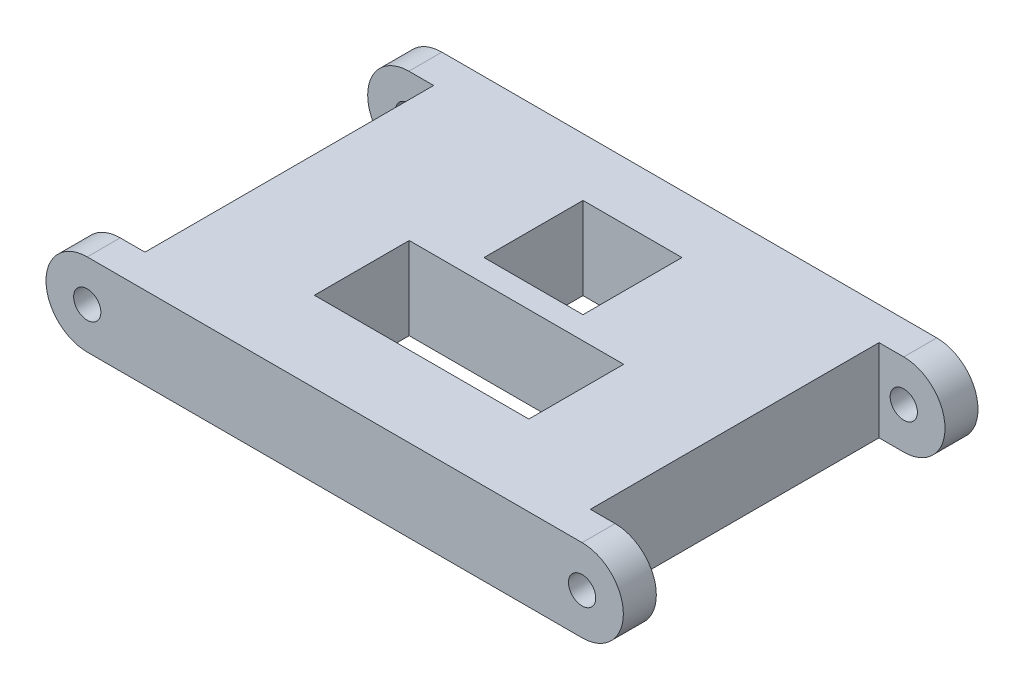
ISO-10303-21;
HEADER;
FILE_DESCRIPTION(('STEP AP214'),'2;1');
FILE_NAME('part.step','',(''),(''),'','','');
FILE_SCHEMA(('AUTOMOTIVE_DESIGN { 1 0 10303 214 1 1 1 1 }'));
ENDSEC;
DATA;
#1=APPLICATION_CONTEXT('core data for automotive mechanical design processes');
#2=APPLICATION_PROTOCOL_DEFINITION('international standard','automotive_design',2000,#1);
#3=PRODUCT_CONTEXT('',#1,'mechanical');
#4=PRODUCT('Part','Part','',(#3));
#5=PRODUCT_RELATED_PRODUCT_CATEGORY('part','',(#4));
#6=PRODUCT_DEFINITION_FORMATION('','',#4);
#7=PRODUCT_DEFINITION_CONTEXT('part definition',#1,'design');
#8=PRODUCT_DEFINITION('design','',#6,#7);
#9=PRODUCT_DEFINITION_SHAPE('','',#8);
#10=(LENGTH_UNIT() NAMED_UNIT(*) SI_UNIT(.MILLI.,.METRE.));
#11=(NAMED_UNIT(*) PLANE_ANGLE_UNIT() SI_UNIT($,.RADIAN.));
#12=(NAMED_UNIT(*) SI_UNIT($,.STERADIAN.) SOLID_ANGLE_UNIT());
#13=UNCERTAINTY_MEASURE_WITH_UNIT(LENGTH_MEASURE(1.E-05),#10,'distance_accuracy_value','');
#14=(GEOMETRIC_REPRESENTATION_CONTEXT(3) GLOBAL_UNCERTAINTY_ASSIGNED_CONTEXT((#13)) GLOBAL_UNIT_ASSIGNED_CONTEXT((#10,
#11,#12)) REPRESENTATION_CONTEXT('',''));
#15=CARTESIAN_POINT('',(0.,0.,0.));
#16=DIRECTION('',(0.,0.,1.));
#17=DIRECTION('',(1.,0.,0.));
#18=AXIS2_PLACEMENT_3D('',#15,#16,#17);
#19=CARTESIAN_POINT('',(0.,0.,4.));
#20=DIRECTION('',(0.,0.,1.));
#21=DIRECTION('',(1.,0.,0.));
#22=AXIS2_PLACEMENT_3D('',#19,#20,#21);
#23=PLANE('',#22);
#24=CARTESIAN_POINT('',(60.,0.,4.));
#25=DIRECTION('',(0.,0.,1.));
#26=DIRECTION('',(1.,0.,0.));
#27=AXIS2_PLACEMENT_3D('',#24,#25,#26);
#28=CIRCLE('',#27,1.65);
#29=CARTESIAN_POINT('',(61.65,0.,4.));
#30=VERTEX_POINT('',#29);
#31=EDGE_CURVE('E331',#30,#30,#28,.T.);
#32=ORIENTED_EDGE('',*,*,#31,.F.);
#33=EDGE_LOOP('',(#32));
#34=FACE_BOUND('',#33,.T.);
#35=DIRECTION('',(1.,0.,0.));
#36=VECTOR('',#35,1.);
#37=CARTESIAN_POINT('',(0.,5.,4.));
#38=LINE('',#37,#36);
#39=CARTESIAN_POINT('',(57.,5.,4.));
#40=VERTEX_POINT('',#39);
#41=CARTESIAN_POINT('',(60.,5.,4.));
#42=VERTEX_POINT('',#41);
#43=EDGE_CURVE('E321',#40,#42,#38,.T.);
#44=ORIENTED_EDGE('',*,*,#43,.F.);
#45=DIRECTION('',(0.,-1.,0.));
#46=VECTOR('',#45,1.);
#47=CARTESIAN_POINT('',(57.,5.,4.));
#48=LINE('',#47,#46);
#49=CARTESIAN_POINT('',(57.,-5.,4.));
#50=VERTEX_POINT('',#49);
#51=EDGE_CURVE('E299',#40,#50,#48,.T.);
#52=ORIENTED_EDGE('',*,*,#51,.T.);
#53=DIRECTION('',(-1.,0.,0.));
#54=VECTOR('',#53,1.);
#55=CARTESIAN_POINT('',(0.,-5.,4.));
#56=LINE('',#55,#54);
#57=CARTESIAN_POINT('',(60.,-5.,4.));
#58=VERTEX_POINT('',#57);
#59=EDGE_CURVE('E314',#58,#50,#56,.T.);
#60=ORIENTED_EDGE('',*,*,#59,.F.);
#61=CARTESIAN_POINT('',(60.,0.,4.));
#62=DIRECTION('',(0.,0.,1.));
#63=DIRECTION('',(1.,0.,0.));
#64=AXIS2_PLACEMENT_3D('',#61,#62,#63);
#65=CIRCLE('',#64,5.);
#66=EDGE_CURVE('E317',#58,#42,#65,.T.);
#67=ORIENTED_EDGE('',*,*,#66,.T.);
#68=EDGE_LOOP('',(#44,#52,#60,#67));
#69=FACE_BOUND('',#68,.T.);
#70=ADVANCED_FACE('F36',(#34,#69),#23,.T.);
#71=CARTESIAN_POINT('',(0.,-5.,4.));
#72=DIRECTION('',(0.,-1.,0.));
#73=DIRECTION('',(0.,0.,-1.));
#74=AXIS2_PLACEMENT_3D('',#71,#72,#73);
#75=PLANE('',#74);
#76=DIRECTION('',(1.,0.,0.));
#77=VECTOR('',#76,1.);
#78=CARTESIAN_POINT('',(0.,-5.,21.7568160421216));
#79=LINE('',#78,#77);
#80=CARTESIAN_POINT('',(17.7948409969749,-5.,21.7568160421216));
#81=VERTEX_POINT('',#80);
#82=CARTESIAN_POINT('',(43.7948409969749,-5.,21.7568160421216));
#83=VERTEX_POINT('',#82);
#84=EDGE_CURVE('E187',#81,#83,#79,.T.);
#85=ORIENTED_EDGE('',*,*,#84,.F.);
#86=DIRECTION('',(0.,0.,-1.));
#87=VECTOR('',#86,1.);
#88=CARTESIAN_POINT('',(17.7948409969749,-5.,3.99999999999999));
#89=LINE('',#88,#87);
#90=CARTESIAN_POINT('',(17.7948409969749,-5.,33.2568160421216));
#91=VERTEX_POINT('',#90);
#92=EDGE_CURVE('E240',#91,#81,#89,.T.);
#93=ORIENTED_EDGE('',*,*,#92,.F.);
#94=DIRECTION('',(1.,0.,0.));
#95=VECTOR('',#94,1.);
#96=CARTESIAN_POINT('',(0.,-5.,33.2568160421216));
#97=LINE('',#96,#95);
#98=CARTESIAN_POINT('',(43.7948409969749,-5.,33.2568160421216));
#99=VERTEX_POINT('',#98);
#100=EDGE_CURVE('E237',#91,#99,#97,.T.);
#101=ORIENTED_EDGE('',*,*,#100,.T.);
#102=DIRECTION('',(0.,0.,-1.));
#103=VECTOR('',#102,1.);
#104=CARTESIAN_POINT('',(43.7948409969749,-5.,4.));
#105=LINE('',#104,#103);
#106=EDGE_CURVE('E235',#99,#83,#105,.T.);
#107=ORIENTED_EDGE('',*,*,#106,.T.);
#108=EDGE_LOOP('',(#85,#93,#101,#107));
#109=FACE_BOUND('',#108,.T.);
#110=DIRECTION('',(1.,0.,0.));
#111=VECTOR('',#110,1.);
#112=CARTESIAN_POINT('',(0.,-5.,7.01289265091276));
#113=LINE('',#112,#111);
#114=CARTESIAN_POINT('',(24.1223046181314,-5.,7.01289265091276));
#115=VERTEX_POINT('',#114);
#116=CARTESIAN_POINT('',(36.1223046181314,-5.,7.01289265091276));
#117=VERTEX_POINT('',#116);
#118=EDGE_CURVE('E233',#115,#117,#113,.T.);
#119=ORIENTED_EDGE('',*,*,#118,.F.);
#120=DIRECTION('',(0.,0.,-1.));
#121=VECTOR('',#120,1.);
#122=CARTESIAN_POINT('',(24.1223046181314,-5.,4.));
#123=LINE('',#122,#121);
#124=CARTESIAN_POINT('',(24.1223046181314,-5.,19.0128926509128));
#125=VERTEX_POINT('',#124);
#126=EDGE_CURVE('E231',#125,#115,#123,.T.);
#127=ORIENTED_EDGE('',*,*,#126,.F.);
#128=DIRECTION('',(1.,0.,0.));
#129=VECTOR('',#128,1.);
#130=CARTESIAN_POINT('',(0.,-5.,19.0128926509128));
#131=LINE('',#130,#129);
#132=CARTESIAN_POINT('',(36.1223046181314,-5.,19.0128926509128));
#133=VERTEX_POINT('',#132);
#134=EDGE_CURVE('E228',#125,#133,#131,.T.);
#135=ORIENTED_EDGE('',*,*,#134,.T.);
#136=DIRECTION('',(0.,0.,-1.));
#137=VECTOR('',#136,1.);
#138=CARTESIAN_POINT('',(36.1223046181314,-5.,4.));
#139=LINE('',#138,#137);
#140=EDGE_CURVE('E204',#133,#117,#139,.T.);
#141=ORIENTED_EDGE('',*,*,#140,.T.);
#142=EDGE_LOOP('',(#119,#127,#135,#141));
#143=FACE_BOUND('',#142,.T.);
#144=DIRECTION('',(-1.,0.,0.));
#145=VECTOR('',#144,1.);
#146=CARTESIAN_POINT('',(0.,-5.,0.));
#147=LINE('',#146,#145);
#148=CARTESIAN_POINT('',(60.,-5.,0.));
#149=VERTEX_POINT('',#148);
#150=CARTESIAN_POINT('',(0.,-5.,0.));
#151=VERTEX_POINT('',#150);
#152=EDGE_CURVE('E313',#149,#151,#147,.T.);
#153=ORIENTED_EDGE('',*,*,#152,.F.);
#154=DIRECTION('',(0.,0.,-1.));
#155=VECTOR('',#154,1.);
#156=CARTESIAN_POINT('',(60.,-5.,4.));
#157=LINE('',#156,#155);
#158=EDGE_CURVE('E11',#58,#149,#157,.T.);
#159=ORIENTED_EDGE('',*,*,#158,.F.);
#160=ORIENTED_EDGE('',*,*,#59,.T.);
#161=DIRECTION('',(0.,0.,-1.));
#162=VECTOR('',#161,1.);
#163=CARTESIAN_POINT('',(57.,-5.,21.5));
#164=LINE('',#163,#162);
#165=CARTESIAN_POINT('',(57.,-5.,39.));
#166=VERTEX_POINT('',#165);
#167=EDGE_CURVE('E304',#166,#50,#164,.T.);
#168=ORIENTED_EDGE('',*,*,#167,.F.);
#169=DIRECTION('',(-1.,0.,0.));
#170=VECTOR('',#169,1.);
#171=CARTESIAN_POINT('',(0.,-5.,39.));
#172=LINE('',#171,#170);
#173=CARTESIAN_POINT('',(60.,-5.,39.));
#174=VERTEX_POINT('',#173);
#175=EDGE_CURVE('E250',#174,#166,#172,.T.);
#176=ORIENTED_EDGE('',*,*,#175,.F.);
#177=DIRECTION('',(0.,0.,1.));
#178=VECTOR('',#177,1.);
#179=CARTESIAN_POINT('',(60.,-5.,39.));
#180=LINE('',#179,#178);
#181=CARTESIAN_POINT('',(60.,-5.,43.));
#182=VERTEX_POINT('',#181);
#183=EDGE_CURVE('E293',#174,#182,#180,.T.);
#184=ORIENTED_EDGE('',*,*,#183,.T.);
#185=DIRECTION('',(-1.,0.,0.));
#186=VECTOR('',#185,1.);
#187=CARTESIAN_POINT('',(0.,-5.,43.));
#188=LINE('',#187,#186);
#189=CARTESIAN_POINT('',(0.,-5.,43.));
#190=VERTEX_POINT('',#189);
#191=EDGE_CURVE('E249',#182,#190,#188,.T.);
#192=ORIENTED_EDGE('',*,*,#191,.T.);
#193=DIRECTION('',(0.,0.,1.));
#194=VECTOR('',#193,1.);
#195=CARTESIAN_POINT('',(0.,-5.,39.));
#196=LINE('',#195,#194);
#197=CARTESIAN_POINT('',(0.,-5.,39.));
#198=VERTEX_POINT('',#197);
#199=EDGE_CURVE('E269',#198,#190,#196,.T.);
#200=ORIENTED_EDGE('',*,*,#199,.F.);
#201=CARTESIAN_POINT('',(2.99999999999999,-5.,39.));
#202=VERTEX_POINT('',#201);
#203=EDGE_CURVE('E254',#202,#198,#172,.T.);
#204=ORIENTED_EDGE('',*,*,#203,.F.);
#205=DIRECTION('',(0.,0.,-1.));
#206=VECTOR('',#205,1.);
#207=CARTESIAN_POINT('',(2.99999999999999,-5.,21.5));
#208=LINE('',#207,#206);
#209=CARTESIAN_POINT('',(2.99999999999999,-5.,4.));
#210=VERTEX_POINT('',#209);
#211=EDGE_CURVE('E307',#202,#210,#208,.T.);
#212=ORIENTED_EDGE('',*,*,#211,.T.);
#213=CARTESIAN_POINT('',(0.,-5.,4.));
#214=VERTEX_POINT('',#213);
#215=EDGE_CURVE('E318',#210,#214,#56,.T.);
#216=ORIENTED_EDGE('',*,*,#215,.T.);
#217=DIRECTION('',(0.,0.,-1.));
#218=VECTOR('',#217,1.);
#219=CARTESIAN_POINT('',(0.,-5.,4.));
#220=LINE('',#219,#218);
#221=EDGE_CURVE('E334',#214,#151,#220,.T.);
#222=ORIENTED_EDGE('',*,*,#221,.T.);
#223=EDGE_LOOP('',(#153,#159,#160,#168,#176,#184,#192,#200,#204,#212,#216,#222));
#224=FACE_BOUND('',#223,.T.);
#225=ADVANCED_FACE('F38',(#109,#143,#224),#75,.T.);
#226=CARTESIAN_POINT('',(60.,0.,4.));
#227=DIRECTION('',(0.,0.,-1.));
#228=DIRECTION('',(-1.,0.,0.));
#229=AXIS2_PLACEMENT_3D('',#226,#227,#228);
#230=CYLINDRICAL_SURFACE('',#229,5.);
#231=CARTESIAN_POINT('',(60.,0.,0.));
#232=DIRECTION('',(0.,0.,1.));
#233=DIRECTION('',(1.,0.,0.));
#234=AXIS2_PLACEMENT_3D('',#231,#232,#233);
#235=CIRCLE('',#234,5.);
#236=CARTESIAN_POINT('',(60.,5.,0.));
#237=VERTEX_POINT('',#236);
#238=EDGE_CURVE('E337',#149,#237,#235,.T.);
#239=ORIENTED_EDGE('',*,*,#238,.T.);
#240=DIRECTION('',(0.,0.,-1.));
#241=VECTOR('',#240,1.);
#242=CARTESIAN_POINT('',(60.,5.,4.));
#243=LINE('',#242,#241);
#244=EDGE_CURVE('E44',#42,#237,#243,.T.);
#245=ORIENTED_EDGE('',*,*,#244,.F.);
#246=ORIENTED_EDGE('',*,*,#66,.F.);
#247=ORIENTED_EDGE('',*,*,#158,.T.);
#248=EDGE_LOOP('',(#239,#245,#246,#247));
#249=FACE_BOUND('',#248,.T.);
#250=ADVANCED_FACE('F360',(#249),#230,.T.);
#251=CARTESIAN_POINT('',(0.,5.,4.));
#252=DIRECTION('',(0.,1.,0.));
#253=DIRECTION('',(0.,0.,1.));
#254=AXIS2_PLACEMENT_3D('',#251,#252,#253);
#255=PLANE('',#254);
#256=DIRECTION('',(1.,0.,0.));
#257=VECTOR('',#256,1.);
#258=CARTESIAN_POINT('',(17.7948409969749,5.,21.7568160421216));
#259=LINE('',#258,#257);
#260=CARTESIAN_POINT('',(17.7948409969749,5.,21.7568160421216));
#261=VERTEX_POINT('',#260);
#262=CARTESIAN_POINT('',(43.7948409969749,5.,21.7568160421216));
#263=VERTEX_POINT('',#262);
#264=EDGE_CURVE('E179',#261,#263,#259,.T.);
#265=ORIENTED_EDGE('',*,*,#264,.T.);
#266=DIRECTION('',(0.,0.,-1.));
#267=VECTOR('',#266,1.);
#268=CARTESIAN_POINT('',(43.7948409969749,5.,33.2568160421216));
#269=LINE('',#268,#267);
#270=CARTESIAN_POINT('',(43.7948409969749,5.,33.2568160421216));
#271=VERTEX_POINT('',#270);
#272=EDGE_CURVE('E170',#271,#263,#269,.T.);
#273=ORIENTED_EDGE('',*,*,#272,.F.);
#274=DIRECTION('',(1.,0.,0.));
#275=VECTOR('',#274,1.);
#276=CARTESIAN_POINT('',(17.7948409969749,5.,33.2568160421216));
#277=LINE('',#276,#275);
#278=CARTESIAN_POINT('',(17.7948409969749,5.,33.2568160421216));
#279=VERTEX_POINT('',#278);
#280=EDGE_CURVE('E178',#279,#271,#277,.T.);
#281=ORIENTED_EDGE('',*,*,#280,.F.);
#282=DIRECTION('',(0.,0.,-1.));
#283=VECTOR('',#282,1.);
#284=CARTESIAN_POINT('',(17.7948409969749,5.,33.2568160421216));
#285=LINE('',#284,#283);
#286=EDGE_CURVE('E189',#279,#261,#285,.T.);
#287=ORIENTED_EDGE('',*,*,#286,.T.);
#288=EDGE_LOOP('',(#265,#273,#281,#287));
#289=FACE_BOUND('',#288,.T.);
#290=DIRECTION('',(1.,0.,0.));
#291=VECTOR('',#290,1.);
#292=CARTESIAN_POINT('',(24.1223046181314,5.,7.01289265091276));
#293=LINE('',#292,#291);
#294=CARTESIAN_POINT('',(24.1223046181314,5.,7.01289265091276));
#295=VERTEX_POINT('',#294);
#296=CARTESIAN_POINT('',(36.1223046181314,5.,7.01289265091276));
#297=VERTEX_POINT('',#296);
#298=EDGE_CURVE('E194',#295,#297,#293,.T.);
#299=ORIENTED_EDGE('',*,*,#298,.T.);
#300=DIRECTION('',(0.,0.,-1.));
#301=VECTOR('',#300,1.);
#302=CARTESIAN_POINT('',(36.1223046181314,5.,19.0128926509128));
#303=LINE('',#302,#301);
#304=CARTESIAN_POINT('',(36.1223046181314,5.,19.0128926509128));
#305=VERTEX_POINT('',#304);
#306=EDGE_CURVE('E197',#305,#297,#303,.T.);
#307=ORIENTED_EDGE('',*,*,#306,.F.);
#308=DIRECTION('',(1.,0.,0.));
#309=VECTOR('',#308,1.);
#310=CARTESIAN_POINT('',(24.1223046181314,5.,19.0128926509128));
#311=LINE('',#310,#309);
#312=CARTESIAN_POINT('',(24.1223046181314,5.,19.0128926509128));
#313=VERTEX_POINT('',#312);
#314=EDGE_CURVE('E222',#313,#305,#311,.T.);
#315=ORIENTED_EDGE('',*,*,#314,.F.);
#316=DIRECTION('',(0.,0.,-1.));
#317=VECTOR('',#316,1.);
#318=CARTESIAN_POINT('',(24.1223046181314,5.,19.0128926509128));
#319=LINE('',#318,#317);
#320=EDGE_CURVE('E210',#313,#295,#319,.T.);
#321=ORIENTED_EDGE('',*,*,#320,.T.);
#322=EDGE_LOOP('',(#299,#307,#315,#321));
#323=FACE_BOUND('',#322,.T.);
#324=DIRECTION('',(1.,0.,0.));
#325=VECTOR('',#324,1.);
#326=CARTESIAN_POINT('',(0.,5.,0.));
#327=LINE('',#326,#325);
#328=CARTESIAN_POINT('',(0.,5.,0.));
#329=VERTEX_POINT('',#328);
#330=EDGE_CURVE('E340',#329,#237,#327,.T.);
#331=ORIENTED_EDGE('',*,*,#330,.F.);
#332=DIRECTION('',(0.,0.,-1.));
#333=VECTOR('',#332,1.);
#334=CARTESIAN_POINT('',(0.,5.,4.));
#335=LINE('',#334,#333);
#336=CARTESIAN_POINT('',(0.,5.,4.));
#337=VERTEX_POINT('',#336);
#338=EDGE_CURVE('E353',#337,#329,#335,.T.);
#339=ORIENTED_EDGE('',*,*,#338,.F.);
#340=CARTESIAN_POINT('',(2.99999999999999,5.,4.));
#341=VERTEX_POINT('',#340);
#342=EDGE_CURVE('E322',#337,#341,#38,.T.);
#343=ORIENTED_EDGE('',*,*,#342,.T.);
#344=DIRECTION('',(0.,0.,-1.));
#345=VECTOR('',#344,1.);
#346=CARTESIAN_POINT('',(3.,5.,21.5));
#347=LINE('',#346,#345);
#348=CARTESIAN_POINT('',(2.99999999999999,5.,39.));
#349=VERTEX_POINT('',#348);
#350=EDGE_CURVE('E310',#349,#341,#347,.T.);
#351=ORIENTED_EDGE('',*,*,#350,.F.);
#352=DIRECTION('',(1.,0.,0.));
#353=VECTOR('',#352,1.);
#354=CARTESIAN_POINT('',(0.,5.,39.));
#355=LINE('',#354,#353);
#356=CARTESIAN_POINT('',(0.,5.,39.));
#357=VERTEX_POINT('',#356);
#358=EDGE_CURVE('E258',#357,#349,#355,.T.);
#359=ORIENTED_EDGE('',*,*,#358,.F.);
#360=DIRECTION('',(0.,0.,1.));
#361=VECTOR('',#360,1.);
#362=CARTESIAN_POINT('',(0.,5.,39.));
#363=LINE('',#362,#361);
#364=CARTESIAN_POINT('',(0.,5.,43.));
#365=VERTEX_POINT('',#364);
#366=EDGE_CURVE('E287',#357,#365,#363,.T.);
#367=ORIENTED_EDGE('',*,*,#366,.T.);
#368=DIRECTION('',(1.,0.,0.));
#369=VECTOR('',#368,1.);
#370=CARTESIAN_POINT('',(0.,5.,43.));
#371=LINE('',#370,#369);
#372=CARTESIAN_POINT('',(60.,5.,43.));
#373=VERTEX_POINT('',#372);
#374=EDGE_CURVE('E275',#365,#373,#371,.T.);
#375=ORIENTED_EDGE('',*,*,#374,.T.);
#376=DIRECTION('',(0.,0.,1.));
#377=VECTOR('',#376,1.);
#378=CARTESIAN_POINT('',(60.,5.,39.));
#379=LINE('',#378,#377);
#380=CARTESIAN_POINT('',(60.,5.,39.));
#381=VERTEX_POINT('',#380);
#382=EDGE_CURVE('E290',#381,#373,#379,.T.);
#383=ORIENTED_EDGE('',*,*,#382,.F.);
#384=CARTESIAN_POINT('',(57.,5.,39.));
#385=VERTEX_POINT('',#384);
#386=EDGE_CURVE('E257',#385,#381,#355,.T.);
#387=ORIENTED_EDGE('',*,*,#386,.F.);
#388=DIRECTION('',(0.,0.,-1.));
#389=VECTOR('',#388,1.);
#390=CARTESIAN_POINT('',(57.,5.,21.5));
#391=LINE('',#390,#389);
#392=EDGE_CURVE('E301',#385,#40,#391,.T.);
#393=ORIENTED_EDGE('',*,*,#392,.T.);
#394=ORIENTED_EDGE('',*,*,#43,.T.);
#395=ORIENTED_EDGE('',*,*,#244,.T.);
#396=EDGE_LOOP('',(#331,#339,#343,#351,#359,#367,#375,#383,#387,#393,#394,#395));
#397=FACE_BOUND('',#396,.T.);
#398=ADVANCED_FACE('F191',(#289,#323,#397),#255,.T.);
#399=CARTESIAN_POINT('',(0.,0.,4.));
#400=DIRECTION('',(0.,0.,-1.));
#401=DIRECTION('',(-1.,0.,0.));
#402=AXIS2_PLACEMENT_3D('',#399,#400,#401);
#403=CYLINDRICAL_SURFACE('',#402,1.65);
#404=CARTESIAN_POINT('',(0.,0.,4.));
#405=DIRECTION('',(0.,0.,1.));
#406=DIRECTION('',(1.,0.,0.));
#407=AXIS2_PLACEMENT_3D('',#404,#405,#406);
#408=CIRCLE('',#407,1.65);
#409=CARTESIAN_POINT('',(1.65,0.,4.));
#410=VERTEX_POINT('',#409);
#411=EDGE_CURVE('E328',#410,#410,#408,.T.);
#412=ORIENTED_EDGE('',*,*,#411,.T.);
#413=EDGE_LOOP('',(#412));
#414=FACE_BOUND('',#413,.T.);
#415=CARTESIAN_POINT('',(0.,0.,0.));
#416=DIRECTION('',(0.,0.,1.));
#417=DIRECTION('',(1.,0.,0.));
#418=AXIS2_PLACEMENT_3D('',#415,#416,#417);
#419=CIRCLE('',#418,1.65);
#420=CARTESIAN_POINT('',(1.65,0.,0.));
#421=VERTEX_POINT('',#420);
#422=EDGE_CURVE('E346',#421,#421,#419,.T.);
#423=ORIENTED_EDGE('',*,*,#422,.F.);
#424=EDGE_LOOP('',(#423));
#425=FACE_BOUND('',#424,.T.);
#426=ADVANCED_FACE('F411',(#414,#425),#403,.F.);
#427=CARTESIAN_POINT('',(0.,0.,4.));
#428=DIRECTION('',(0.,0.,-1.));
#429=DIRECTION('',(-1.,0.,0.));
#430=AXIS2_PLACEMENT_3D('',#427,#428,#429);
#431=CYLINDRICAL_SURFACE('',#430,5.);
#432=CARTESIAN_POINT('',(0.,0.,0.));
#433=DIRECTION('',(0.,0.,1.));
#434=DIRECTION('',(1.,0.,0.));
#435=AXIS2_PLACEMENT_3D('',#432,#433,#434);
#436=CIRCLE('',#435,5.);
#437=EDGE_CURVE('E343',#329,#151,#436,.T.);
#438=ORIENTED_EDGE('',*,*,#437,.T.);
#439=ORIENTED_EDGE('',*,*,#221,.F.);
#440=CARTESIAN_POINT('',(0.,0.,4.));
#441=DIRECTION('',(0.,0.,1.));
#442=DIRECTION('',(1.,0.,0.));
#443=AXIS2_PLACEMENT_3D('',#440,#441,#442);
#444=CIRCLE('',#443,5.);
#445=EDGE_CURVE('E325',#337,#214,#444,.T.);
#446=ORIENTED_EDGE('',*,*,#445,.F.);
#447=ORIENTED_EDGE('',*,*,#338,.T.);
#448=EDGE_LOOP('',(#438,#439,#446,#447));
#449=FACE_BOUND('',#448,.T.);
#450=ADVANCED_FACE('F368',(#449),#431,.T.);
#451=CARTESIAN_POINT('',(60.,0.,4.));
#452=DIRECTION('',(0.,0.,-1.));
#453=DIRECTION('',(-1.,0.,0.));
#454=AXIS2_PLACEMENT_3D('',#451,#452,#453);
#455=CYLINDRICAL_SURFACE('',#454,1.65);
#456=ORIENTED_EDGE('',*,*,#31,.T.);
#457=EDGE_LOOP('',(#456));
#458=FACE_BOUND('',#457,.T.);
#459=CARTESIAN_POINT('',(60.,0.,0.));
#460=DIRECTION('',(0.,0.,1.));
#461=DIRECTION('',(1.,0.,0.));
#462=AXIS2_PLACEMENT_3D('',#459,#460,#461);
#463=CIRCLE('',#462,1.65);
#464=CARTESIAN_POINT('',(61.65,0.,0.));
#465=VERTEX_POINT('',#464);
#466=EDGE_CURVE('E349',#465,#465,#463,.T.);
#467=ORIENTED_EDGE('',*,*,#466,.F.);
#468=EDGE_LOOP('',(#467));
#469=FACE_BOUND('',#468,.T.);
#470=ADVANCED_FACE('F407',(#458,#469),#455,.F.);
#471=DIRECTION('',(0.,-1.,0.));
#472=VECTOR('',#471,1.);
#473=CARTESIAN_POINT('',(3.,5.,4.));
#474=LINE('',#473,#472);
#475=EDGE_CURVE('E296',#341,#210,#474,.T.);
#476=ORIENTED_EDGE('',*,*,#475,.F.);
#477=ORIENTED_EDGE('',*,*,#342,.F.);
#478=ORIENTED_EDGE('',*,*,#445,.T.);
#479=ORIENTED_EDGE('',*,*,#215,.F.);
#480=EDGE_LOOP('',(#476,#477,#478,#479));
#481=FACE_BOUND('',#480,.T.);
#482=ORIENTED_EDGE('',*,*,#411,.F.);
#483=EDGE_LOOP('',(#482));
#484=FACE_BOUND('',#483,.T.);
#485=ADVANCED_FACE('F404',(#481,#484),#23,.T.);
#486=CARTESIAN_POINT('',(0.,0.,0.));
#487=DIRECTION('',(0.,0.,1.));
#488=DIRECTION('',(1.,0.,0.));
#489=AXIS2_PLACEMENT_3D('',#486,#487,#488);
#490=PLANE('',#489);
#491=ORIENTED_EDGE('',*,*,#152,.T.);
#492=ORIENTED_EDGE('',*,*,#437,.F.);
#493=ORIENTED_EDGE('',*,*,#330,.T.);
#494=ORIENTED_EDGE('',*,*,#238,.F.);
#495=EDGE_LOOP('',(#491,#492,#493,#494));
#496=FACE_BOUND('',#495,.T.);
#497=ORIENTED_EDGE('',*,*,#422,.T.);
#498=EDGE_LOOP('',(#497));
#499=FACE_BOUND('',#498,.T.);
#500=ORIENTED_EDGE('',*,*,#466,.T.);
#501=EDGE_LOOP('',(#500));
#502=FACE_BOUND('',#501,.T.);
#503=ADVANCED_FACE('F364',(#496,#499,#502),#490,.F.);
#504=CARTESIAN_POINT('',(3.,5.,21.5));
#505=DIRECTION('',(1.,0.,0.));
#506=DIRECTION('',(0.,1.,0.));
#507=AXIS2_PLACEMENT_3D('',#504,#505,#506);
#508=PLANE('',#507);
#509=ORIENTED_EDGE('',*,*,#475,.T.);
#510=ORIENTED_EDGE('',*,*,#211,.F.);
#511=DIRECTION('',(0.,-1.,0.));
#512=VECTOR('',#511,1.);
#513=CARTESIAN_POINT('',(3.,5.,39.));
#514=LINE('',#513,#512);
#515=EDGE_CURVE('E243',#349,#202,#514,.T.);
#516=ORIENTED_EDGE('',*,*,#515,.F.);
#517=ORIENTED_EDGE('',*,*,#350,.T.);
#518=EDGE_LOOP('',(#509,#510,#516,#517));
#519=FACE_BOUND('',#518,.T.);
#520=ADVANCED_FACE('F375',(#519),#508,.F.);
#521=CARTESIAN_POINT('',(57.,5.,21.5));
#522=DIRECTION('',(1.,0.,0.));
#523=DIRECTION('',(0.,0.,-1.));
#524=AXIS2_PLACEMENT_3D('',#521,#522,#523);
#525=PLANE('',#524);
#526=ORIENTED_EDGE('',*,*,#51,.F.);
#527=ORIENTED_EDGE('',*,*,#392,.F.);
#528=DIRECTION('',(0.,-1.,0.));
#529=VECTOR('',#528,1.);
#530=CARTESIAN_POINT('',(57.,5.,39.));
#531=LINE('',#530,#529);
#532=EDGE_CURVE('E246',#385,#166,#531,.T.);
#533=ORIENTED_EDGE('',*,*,#532,.T.);
#534=ORIENTED_EDGE('',*,*,#167,.T.);
#535=EDGE_LOOP('',(#526,#527,#533,#534));
#536=FACE_BOUND('',#535,.T.);
#537=ADVANCED_FACE('F401',(#536),#525,.T.);
#538=CARTESIAN_POINT('',(0.,0.,39.));
#539=DIRECTION('',(0.,0.,-1.));
#540=DIRECTION('',(1.,0.,0.));
#541=AXIS2_PLACEMENT_3D('',#538,#539,#540);
#542=PLANE('',#541);
#543=CARTESIAN_POINT('',(60.,0.,39.));
#544=DIRECTION('',(0.,0.,1.));
#545=DIRECTION('',(1.,0.,0.));
#546=AXIS2_PLACEMENT_3D('',#543,#544,#545);
#547=CIRCLE('',#546,1.65);
#548=CARTESIAN_POINT('',(61.65,0.,39.));
#549=VERTEX_POINT('',#548);
#550=EDGE_CURVE('E266',#549,#549,#547,.T.);
#551=ORIENTED_EDGE('',*,*,#550,.T.);
#552=EDGE_LOOP('',(#551));
#553=FACE_BOUND('',#552,.T.);
#554=ORIENTED_EDGE('',*,*,#386,.T.);
#555=CARTESIAN_POINT('',(60.,0.,39.));
#556=DIRECTION('',(0.,0.,1.));
#557=DIRECTION('',(1.,0.,0.));
#558=AXIS2_PLACEMENT_3D('',#555,#556,#557);
#559=CIRCLE('',#558,5.);
#560=EDGE_CURVE('E253',#174,#381,#559,.T.);
#561=ORIENTED_EDGE('',*,*,#560,.F.);
#562=ORIENTED_EDGE('',*,*,#175,.T.);
#563=ORIENTED_EDGE('',*,*,#532,.F.);
#564=EDGE_LOOP('',(#554,#561,#562,#563));
#565=FACE_BOUND('',#564,.T.);
#566=ADVANCED_FACE('F397',(#553,#565),#542,.T.);
#567=CARTESIAN_POINT('',(60.,0.,39.));
#568=DIRECTION('',(0.,0.,1.));
#569=DIRECTION('',(-1.,0.,0.));
#570=AXIS2_PLACEMENT_3D('',#567,#568,#569);
#571=CYLINDRICAL_SURFACE('',#570,5.);
#572=CARTESIAN_POINT('',(60.,0.,43.));
#573=DIRECTION('',(0.,0.,1.));
#574=DIRECTION('',(1.,0.,0.));
#575=AXIS2_PLACEMENT_3D('',#572,#573,#574);
#576=CIRCLE('',#575,5.);
#577=EDGE_CURVE('E272',#182,#373,#576,.T.);
#578=ORIENTED_EDGE('',*,*,#577,.F.);
#579=ORIENTED_EDGE('',*,*,#183,.F.);
#580=ORIENTED_EDGE('',*,*,#560,.T.);
#581=ORIENTED_EDGE('',*,*,#382,.T.);
#582=EDGE_LOOP('',(#578,#579,#580,#581));
#583=FACE_BOUND('',#582,.T.);
#584=ADVANCED_FACE('F389',(#583),#571,.T.);
#585=CARTESIAN_POINT('',(0.,0.,39.));
#586=DIRECTION('',(0.,0.,1.));
#587=DIRECTION('',(-1.,0.,0.));
#588=AXIS2_PLACEMENT_3D('',#585,#586,#587);
#589=CYLINDRICAL_SURFACE('',#588,1.65);
#590=CARTESIAN_POINT('',(0.,0.,39.));
#591=DIRECTION('',(0.,0.,1.));
#592=DIRECTION('',(1.,0.,0.));
#593=AXIS2_PLACEMENT_3D('',#590,#591,#592);
#594=CIRCLE('',#593,1.65);
#595=CARTESIAN_POINT('',(1.65,0.,39.));
#596=VERTEX_POINT('',#595);
#597=EDGE_CURVE('E263',#596,#596,#594,.T.);
#598=ORIENTED_EDGE('',*,*,#597,.F.);
#599=EDGE_LOOP('',(#598));
#600=FACE_BOUND('',#599,.T.);
#601=CARTESIAN_POINT('',(0.,0.,43.));
#602=DIRECTION('',(0.,0.,1.));
#603=DIRECTION('',(1.,0.,0.));
#604=AXIS2_PLACEMENT_3D('',#601,#602,#603);
#605=CIRCLE('',#604,1.65);
#606=CARTESIAN_POINT('',(1.65,0.,43.));
#607=VERTEX_POINT('',#606);
#608=EDGE_CURVE('E279',#607,#607,#605,.T.);
#609=ORIENTED_EDGE('',*,*,#608,.T.);
#610=EDGE_LOOP('',(#609));
#611=FACE_BOUND('',#610,.T.);
#612=ADVANCED_FACE('F442',(#600,#611),#589,.F.);
#613=CARTESIAN_POINT('',(0.,0.,39.));
#614=DIRECTION('',(0.,0.,1.));
#615=DIRECTION('',(-1.,0.,0.));
#616=AXIS2_PLACEMENT_3D('',#613,#614,#615);
#617=CYLINDRICAL_SURFACE('',#616,5.);
#618=CARTESIAN_POINT('',(0.,0.,43.));
#619=DIRECTION('',(0.,0.,1.));
#620=DIRECTION('',(1.,0.,0.));
#621=AXIS2_PLACEMENT_3D('',#618,#619,#620);
#622=CIRCLE('',#621,5.);
#623=EDGE_CURVE('E277',#365,#190,#622,.T.);
#624=ORIENTED_EDGE('',*,*,#623,.F.);
#625=ORIENTED_EDGE('',*,*,#366,.F.);
#626=CARTESIAN_POINT('',(0.,0.,39.));
#627=DIRECTION('',(0.,0.,1.));
#628=DIRECTION('',(1.,0.,0.));
#629=AXIS2_PLACEMENT_3D('',#626,#627,#628);
#630=CIRCLE('',#629,5.);
#631=EDGE_CURVE('E261',#357,#198,#630,.T.);
#632=ORIENTED_EDGE('',*,*,#631,.T.);
#633=ORIENTED_EDGE('',*,*,#199,.T.);
#634=EDGE_LOOP('',(#624,#625,#632,#633));
#635=FACE_BOUND('',#634,.T.);
#636=ADVANCED_FACE('F443',(#635),#617,.T.);
#637=CARTESIAN_POINT('',(60.,0.,39.));
#638=DIRECTION('',(0.,0.,1.));
#639=DIRECTION('',(-1.,0.,0.));
#640=AXIS2_PLACEMENT_3D('',#637,#638,#639);
#641=CYLINDRICAL_SURFACE('',#640,1.65);
#642=ORIENTED_EDGE('',*,*,#550,.F.);
#643=EDGE_LOOP('',(#642));
#644=FACE_BOUND('',#643,.T.);
#645=CARTESIAN_POINT('',(60.,0.,43.));
#646=DIRECTION('',(0.,0.,1.));
#647=DIRECTION('',(1.,0.,0.));
#648=AXIS2_PLACEMENT_3D('',#645,#646,#647);
#649=CIRCLE('',#648,1.65);
#650=CARTESIAN_POINT('',(61.65,0.,43.));
#651=VERTEX_POINT('',#650);
#652=EDGE_CURVE('E282',#651,#651,#649,.T.);
#653=ORIENTED_EDGE('',*,*,#652,.T.);
#654=EDGE_LOOP('',(#653));
#655=FACE_BOUND('',#654,.T.);
#656=ADVANCED_FACE('F446',(#644,#655),#641,.F.);
#657=ORIENTED_EDGE('',*,*,#515,.T.);
#658=ORIENTED_EDGE('',*,*,#203,.T.);
#659=ORIENTED_EDGE('',*,*,#631,.F.);
#660=ORIENTED_EDGE('',*,*,#358,.T.);
#661=EDGE_LOOP('',(#657,#658,#659,#660));
#662=FACE_BOUND('',#661,.T.);
#663=ORIENTED_EDGE('',*,*,#597,.T.);
#664=EDGE_LOOP('',(#663));
#665=FACE_BOUND('',#664,.T.);
#666=ADVANCED_FACE('F379',(#662,#665),#542,.T.);
#667=CARTESIAN_POINT('',(0.,0.,43.));
#668=DIRECTION('',(0.,0.,-1.));
#669=DIRECTION('',(1.,0.,0.));
#670=AXIS2_PLACEMENT_3D('',#667,#668,#669);
#671=PLANE('',#670);
#672=ORIENTED_EDGE('',*,*,#191,.F.);
#673=ORIENTED_EDGE('',*,*,#577,.T.);
#674=ORIENTED_EDGE('',*,*,#374,.F.);
#675=ORIENTED_EDGE('',*,*,#623,.T.);
#676=EDGE_LOOP('',(#672,#673,#674,#675));
#677=FACE_BOUND('',#676,.T.);
#678=ORIENTED_EDGE('',*,*,#608,.F.);
#679=EDGE_LOOP('',(#678));
#680=FACE_BOUND('',#679,.T.);
#681=ORIENTED_EDGE('',*,*,#652,.F.);
#682=EDGE_LOOP('',(#681));
#683=FACE_BOUND('',#682,.T.);
#684=ADVANCED_FACE('F386',(#677,#680,#683),#671,.F.);
#685=CARTESIAN_POINT('',(24.1223046181314,5.,7.01289265091276));
#686=DIRECTION('',(0.,0.,-1.));
#687=DIRECTION('',(-1.,0.,0.));
#688=AXIS2_PLACEMENT_3D('',#685,#686,#687);
#689=PLANE('',#688);
#690=ORIENTED_EDGE('',*,*,#118,.T.);
#691=DIRECTION('',(0.,-1.,0.));
#692=VECTOR('',#691,1.);
#693=CARTESIAN_POINT('',(36.1223046181314,5.,7.01289265091276));
#694=LINE('',#693,#692);
#695=EDGE_CURVE('E59',#297,#117,#694,.T.);
#696=ORIENTED_EDGE('',*,*,#695,.F.);
#697=ORIENTED_EDGE('',*,*,#298,.F.);
#698=DIRECTION('',(0.,-1.,0.));
#699=VECTOR('',#698,1.);
#700=CARTESIAN_POINT('',(24.1223046181314,5.,7.01289265091276));
#701=LINE('',#700,#699);
#702=EDGE_CURVE('E217',#295,#115,#701,.T.);
#703=ORIENTED_EDGE('',*,*,#702,.T.);
#704=EDGE_LOOP('',(#690,#696,#697,#703));
#705=FACE_BOUND('',#704,.T.);
#706=ADVANCED_FACE('F455',(#705),#689,.F.);
#707=CARTESIAN_POINT('',(24.1223046181314,5.,19.0128926509128));
#708=DIRECTION('',(-1.,0.,0.));
#709=DIRECTION('',(0.,0.,1.));
#710=AXIS2_PLACEMENT_3D('',#707,#708,#709);
#711=PLANE('',#710);
#712=ORIENTED_EDGE('',*,*,#126,.T.);
#713=ORIENTED_EDGE('',*,*,#702,.F.);
#714=ORIENTED_EDGE('',*,*,#320,.F.);
#715=DIRECTION('',(0.,-1.,0.));
#716=VECTOR('',#715,1.);
#717=CARTESIAN_POINT('',(24.1223046181314,5.,19.0128926509128));
#718=LINE('',#717,#716);
#719=EDGE_CURVE('E214',#313,#125,#718,.T.);
#720=ORIENTED_EDGE('',*,*,#719,.T.);
#721=EDGE_LOOP('',(#712,#713,#714,#720));
#722=FACE_BOUND('',#721,.T.);
#723=ADVANCED_FACE('F458',(#722),#711,.F.);
#724=CARTESIAN_POINT('',(24.1223046181314,5.,19.0128926509128));
#725=DIRECTION('',(0.,0.,-1.));
#726=DIRECTION('',(-1.,0.,0.));
#727=AXIS2_PLACEMENT_3D('',#724,#725,#726);
#728=PLANE('',#727);
#729=ORIENTED_EDGE('',*,*,#719,.F.);
#730=ORIENTED_EDGE('',*,*,#314,.T.);
#731=DIRECTION('',(0.,-1.,0.));
#732=VECTOR('',#731,1.);
#733=CARTESIAN_POINT('',(36.1223046181314,5.,19.0128926509128));
#734=LINE('',#733,#732);
#735=EDGE_CURVE('E211',#305,#133,#734,.T.);
#736=ORIENTED_EDGE('',*,*,#735,.T.);
#737=ORIENTED_EDGE('',*,*,#134,.F.);
#738=EDGE_LOOP('',(#729,#730,#736,#737));
#739=FACE_BOUND('',#738,.T.);
#740=ADVANCED_FACE('F461',(#739),#728,.T.);
#741=CARTESIAN_POINT('',(36.1223046181314,5.,19.0128926509128));
#742=DIRECTION('',(-1.,0.,0.));
#743=DIRECTION('',(0.,0.,1.));
#744=AXIS2_PLACEMENT_3D('',#741,#742,#743);
#745=PLANE('',#744);
#746=ORIENTED_EDGE('',*,*,#735,.F.);
#747=ORIENTED_EDGE('',*,*,#306,.T.);
#748=ORIENTED_EDGE('',*,*,#695,.T.);
#749=ORIENTED_EDGE('',*,*,#140,.F.);
#750=EDGE_LOOP('',(#746,#747,#748,#749));
#751=FACE_BOUND('',#750,.T.);
#752=ADVANCED_FACE('F465',(#751),#745,.T.);
#753=CARTESIAN_POINT('',(17.7948409969749,5.,21.7568160421216));
#754=DIRECTION('',(0.,0.,-1.));
#755=DIRECTION('',(-1.,0.,0.));
#756=AXIS2_PLACEMENT_3D('',#753,#754,#755);
#757=PLANE('',#756);
#758=ORIENTED_EDGE('',*,*,#84,.T.);
#759=DIRECTION('',(0.,-1.,0.));
#760=VECTOR('',#759,1.);
#761=CARTESIAN_POINT('',(43.7948409969749,5.,21.7568160421216));
#762=LINE('',#761,#760);
#763=EDGE_CURVE('E51',#263,#83,#762,.T.);
#764=ORIENTED_EDGE('',*,*,#763,.F.);
#765=ORIENTED_EDGE('',*,*,#264,.F.);
#766=DIRECTION('',(0.,-1.,0.));
#767=VECTOR('',#766,1.);
#768=CARTESIAN_POINT('',(17.7948409969749,5.,21.7568160421216));
#769=LINE('',#768,#767);
#770=EDGE_CURVE('E202',#261,#81,#769,.T.);
#771=ORIENTED_EDGE('',*,*,#770,.T.);
#772=EDGE_LOOP('',(#758,#764,#765,#771));
#773=FACE_BOUND('',#772,.T.);
#774=ADVANCED_FACE('F183',(#773),#757,.F.);
#775=CARTESIAN_POINT('',(17.7948409969749,5.,33.2568160421216));
#776=DIRECTION('',(-1.,0.,0.));
#777=DIRECTION('',(0.,0.,1.));
#778=AXIS2_PLACEMENT_3D('',#775,#776,#777);
#779=PLANE('',#778);
#780=ORIENTED_EDGE('',*,*,#92,.T.);
#781=ORIENTED_EDGE('',*,*,#770,.F.);
#782=ORIENTED_EDGE('',*,*,#286,.F.);
#783=DIRECTION('',(0.,-1.,0.));
#784=VECTOR('',#783,1.);
#785=CARTESIAN_POINT('',(17.7948409969749,5.,33.2568160421216));
#786=LINE('',#785,#784);
#787=EDGE_CURVE('E205',#279,#91,#786,.T.);
#788=ORIENTED_EDGE('',*,*,#787,.T.);
#789=EDGE_LOOP('',(#780,#781,#782,#788));
#790=FACE_BOUND('',#789,.T.);
#791=ADVANCED_FACE('F474',(#790),#779,.F.);
#792=CARTESIAN_POINT('',(17.7948409969749,5.,33.2568160421216));
#793=DIRECTION('',(0.,0.,-1.));
#794=DIRECTION('',(-1.,0.,0.));
#795=AXIS2_PLACEMENT_3D('',#792,#793,#794);
#796=PLANE('',#795);
#797=ORIENTED_EDGE('',*,*,#787,.F.);
#798=ORIENTED_EDGE('',*,*,#280,.T.);
#799=DIRECTION('',(0.,-1.,0.));
#800=VECTOR('',#799,1.);
#801=CARTESIAN_POINT('',(43.7948409969749,5.,33.2568160421216));
#802=LINE('',#801,#800);
#803=EDGE_CURVE('E173',#271,#99,#802,.T.);
#804=ORIENTED_EDGE('',*,*,#803,.T.);
#805=ORIENTED_EDGE('',*,*,#100,.F.);
#806=EDGE_LOOP('',(#797,#798,#804,#805));
#807=FACE_BOUND('',#806,.T.);
#808=ADVANCED_FACE('F477',(#807),#796,.T.);
#809=CARTESIAN_POINT('',(43.7948409969749,5.,33.2568160421216));
#810=DIRECTION('',(-1.,0.,0.));
#811=DIRECTION('',(0.,0.,1.));
#812=AXIS2_PLACEMENT_3D('',#809,#810,#811);
#813=PLANE('',#812);
#814=ORIENTED_EDGE('',*,*,#803,.F.);
#815=ORIENTED_EDGE('',*,*,#272,.T.);
#816=ORIENTED_EDGE('',*,*,#763,.T.);
#817=ORIENTED_EDGE('',*,*,#106,.F.);
#818=EDGE_LOOP('',(#814,#815,#816,#817));
#819=FACE_BOUND('',#818,.T.);
#820=ADVANCED_FACE('F171',(#819),#813,.T.);
#821=CLOSED_SHELL('',(#70,#225,#250,#398,#426,#450,#470,#485,#503,#520,#537,#566,#584,#612,#636,
#656,#666,#684,#706,#723,#740,#752,#774,#791,#808,#820));
#822=MANIFOLD_SOLID_BREP('B2',#821);
#823=ADVANCED_BREP_SHAPE_REPRESENTATION('',(#18,#822),#14);
#824=SHAPE_DEFINITION_REPRESENTATION(#9,#823);
ENDSEC;
END-ISO-10303-21;
